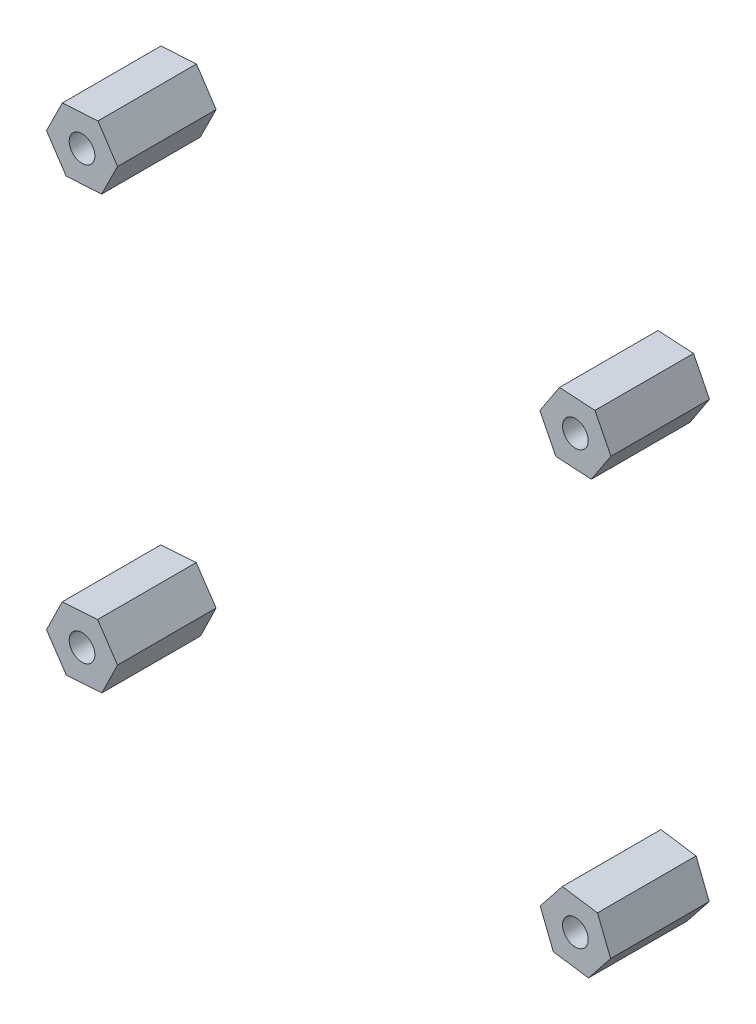
ISO-10303-21;
HEADER;
FILE_DESCRIPTION(('STEP AP214'),'2;1');
FILE_NAME('part.step','',(''),(''),'','','');
FILE_SCHEMA(('AUTOMOTIVE_DESIGN { 1 0 10303 214 1 1 1 1 }'));
ENDSEC;
DATA;
#1=APPLICATION_CONTEXT('core data for automotive mechanical design processes');
#2=APPLICATION_PROTOCOL_DEFINITION('international standard','automotive_design',2000,#1);
#3=PRODUCT_CONTEXT('',#1,'mechanical');
#4=PRODUCT('Part','Part','',(#3));
#5=PRODUCT_RELATED_PRODUCT_CATEGORY('part','',(#4));
#6=PRODUCT_DEFINITION_FORMATION('','',#4);
#7=PRODUCT_DEFINITION_CONTEXT('part definition',#1,'design');
#8=PRODUCT_DEFINITION('design','',#6,#7);
#9=PRODUCT_DEFINITION_SHAPE('','',#8);
#10=(LENGTH_UNIT() NAMED_UNIT(*) SI_UNIT(.MILLI.,.METRE.));
#11=(NAMED_UNIT(*) PLANE_ANGLE_UNIT() SI_UNIT($,.RADIAN.));
#12=(NAMED_UNIT(*) SI_UNIT($,.STERADIAN.) SOLID_ANGLE_UNIT());
#13=UNCERTAINTY_MEASURE_WITH_UNIT(LENGTH_MEASURE(1.E-05),#10,'distance_accuracy_value','');
#14=(GEOMETRIC_REPRESENTATION_CONTEXT(3) GLOBAL_UNCERTAINTY_ASSIGNED_CONTEXT((#13)) GLOBAL_UNIT_ASSIGNED_CONTEXT((#10,
#11,#12)) REPRESENTATION_CONTEXT('',''));
#15=CARTESIAN_POINT('',(0.,0.,0.));
#16=DIRECTION('',(0.,0.,1.));
#17=DIRECTION('',(1.,0.,0.));
#18=AXIS2_PLACEMENT_3D('',#15,#16,#17);
#19=CARTESIAN_POINT('',(0.,0.,9.6));
#20=DIRECTION('',(0.,0.,1.));
#21=DIRECTION('',(1.,0.,0.));
#22=AXIS2_PLACEMENT_3D('',#19,#20,#21);
#23=PLANE('',#22);
#24=DIRECTION('',(0.989172529402275,-0.14675730672067,0.));
#25=VECTOR('',#24,1.);
#26=CARTESIAN_POINT('',(-160.799093625759,61.6851735238354,9.6));
#27=LINE('',#26,#25);
#28=CARTESIAN_POINT('',(-160.799093625759,61.6851735238354,9.6));
#29=VERTEX_POINT('',#28);
#30=CARTESIAN_POINT('',(-157.372499469007,61.1767913005911,9.6));
#31=VERTEX_POINT('',#30);
#32=EDGE_CURVE('E141',#29,#31,#27,.T.);
#33=ORIENTED_EDGE('',*,*,#32,.T.);
#34=DIRECTION('',(0.621681820512219,0.783269885827748,0.));
#35=VECTOR('',#34,1.);
#36=CARTESIAN_POINT('',(-157.372499469007,61.1767913005911,9.6));
#37=LINE('',#36,#35);
#38=CARTESIAN_POINT('',(-155.218930470469,63.8901177771757,9.6));
#39=VERTEX_POINT('',#38);
#40=EDGE_CURVE('E99',#31,#39,#37,.T.);
#41=ORIENTED_EDGE('',*,*,#40,.T.);
#42=DIRECTION('',(-0.367490708890048,0.930027192548417,0.));
#43=VECTOR('',#42,1.);
#44=CARTESIAN_POINT('',(-155.218930470469,63.8901177771757,9.6));
#45=LINE('',#44,#43);
#46=CARTESIAN_POINT('',(-156.491955628683,67.1118264770047,9.6));
#47=VERTEX_POINT('',#46);
#48=EDGE_CURVE('E112',#39,#47,#45,.T.);
#49=ORIENTED_EDGE('',*,*,#48,.T.);
#50=DIRECTION('',(-0.989172529402274,0.146757306720679,0.));
#51=VECTOR('',#50,1.);
#52=CARTESIAN_POINT('',(-156.491955628683,67.1118264770047,9.6));
#53=LINE('',#52,#51);
#54=CARTESIAN_POINT('',(-159.918549785435,67.620208700249,9.6));
#55=VERTEX_POINT('',#54);
#56=EDGE_CURVE('E106',#47,#55,#53,.T.);
#57=ORIENTED_EDGE('',*,*,#56,.T.);
#58=DIRECTION('',(-0.621681820512227,-0.783269885827741,0.));
#59=VECTOR('',#58,1.);
#60=CARTESIAN_POINT('',(-159.918549785435,67.620208700249,9.6));
#61=LINE('',#60,#59);
#62=CARTESIAN_POINT('',(-162.072118783973,64.9068822236644,9.6));
#63=VERTEX_POINT('',#62);
#64=EDGE_CURVE('E110',#55,#63,#61,.T.);
#65=ORIENTED_EDGE('',*,*,#64,.T.);
#66=DIRECTION('',(0.367490708890047,-0.930027192548417,0.));
#67=VECTOR('',#66,1.);
#68=CARTESIAN_POINT('',(-162.072118783973,64.9068822236644,9.6));
#69=LINE('',#68,#67);
#70=EDGE_CURVE('E62',#63,#29,#69,.T.);
#71=ORIENTED_EDGE('',*,*,#70,.T.);
#72=EDGE_LOOP('',(#33,#41,#49,#57,#65,#71));
#73=FACE_BOUND('',#72,.T.);
#74=CARTESIAN_POINT('',(-158.645524627221,64.39850000042,9.6));
#75=DIRECTION('',(0.,0.,1.));
#76=DIRECTION('',(1.,0.,0.));
#77=AXIS2_PLACEMENT_3D('',#74,#75,#76);
#78=CIRCLE('',#77,1.25000000000001);
#79=CARTESIAN_POINT('',(-157.395524627221,64.39850000042,9.6));
#80=VERTEX_POINT('',#79);
#81=EDGE_CURVE('E134',#80,#80,#78,.T.);
#82=ORIENTED_EDGE('',*,*,#81,.F.);
#83=EDGE_LOOP('',(#82));
#84=FACE_BOUND('',#83,.T.);
#85=ADVANCED_FACE('F45',(#73,#84),#23,.T.);
#86=CARTESIAN_POINT('',(0.,0.,0.));
#87=DIRECTION('',(0.,0.,1.));
#88=DIRECTION('',(1.,0.,0.));
#89=AXIS2_PLACEMENT_3D('',#86,#87,#88);
#90=PLANE('',#89);
#91=DIRECTION('',(0.989172529402275,-0.14675730672067,0.));
#92=VECTOR('',#91,1.);
#93=CARTESIAN_POINT('',(-160.799093625759,61.6851735238354,0.));
#94=LINE('',#93,#92);
#95=CARTESIAN_POINT('',(-160.799093625759,61.6851735238354,0.));
#96=VERTEX_POINT('',#95);
#97=CARTESIAN_POINT('',(-157.372499469007,61.1767913005911,0.));
#98=VERTEX_POINT('',#97);
#99=EDGE_CURVE('E130',#96,#98,#94,.T.);
#100=ORIENTED_EDGE('',*,*,#99,.F.);
#101=DIRECTION('',(0.367490708890047,-0.930027192548417,0.));
#102=VECTOR('',#101,1.);
#103=CARTESIAN_POINT('',(-162.072118783973,64.9068822236644,0.));
#104=LINE('',#103,#102);
#105=CARTESIAN_POINT('',(-162.072118783973,64.9068822236644,0.));
#106=VERTEX_POINT('',#105);
#107=EDGE_CURVE('E91',#106,#96,#104,.T.);
#108=ORIENTED_EDGE('',*,*,#107,.F.);
#109=DIRECTION('',(-0.621681820512227,-0.783269885827741,0.));
#110=VECTOR('',#109,1.);
#111=CARTESIAN_POINT('',(-159.918549785435,67.620208700249,0.));
#112=LINE('',#111,#110);
#113=CARTESIAN_POINT('',(-159.918549785435,67.620208700249,0.));
#114=VERTEX_POINT('',#113);
#115=EDGE_CURVE('E85',#114,#106,#112,.T.);
#116=ORIENTED_EDGE('',*,*,#115,.F.);
#117=DIRECTION('',(-0.989172529402274,0.146757306720679,0.));
#118=VECTOR('',#117,1.);
#119=CARTESIAN_POINT('',(-156.491955628683,67.1118264770047,0.));
#120=LINE('',#119,#118);
#121=CARTESIAN_POINT('',(-156.491955628683,67.1118264770047,0.));
#122=VERTEX_POINT('',#121);
#123=EDGE_CURVE('E120',#122,#114,#120,.T.);
#124=ORIENTED_EDGE('',*,*,#123,.F.);
#125=DIRECTION('',(-0.367490708890048,0.930027192548417,0.));
#126=VECTOR('',#125,1.);
#127=CARTESIAN_POINT('',(-155.218930470469,63.8901177771757,0.));
#128=LINE('',#127,#126);
#129=CARTESIAN_POINT('',(-155.218930470469,63.8901177771757,0.));
#130=VERTEX_POINT('',#129);
#131=EDGE_CURVE('E136',#130,#122,#128,.T.);
#132=ORIENTED_EDGE('',*,*,#131,.F.);
#133=DIRECTION('',(0.621681820512219,0.783269885827748,0.));
#134=VECTOR('',#133,1.);
#135=CARTESIAN_POINT('',(-157.372499469007,61.1767913005911,0.));
#136=LINE('',#135,#134);
#137=EDGE_CURVE('E133',#98,#130,#136,.T.);
#138=ORIENTED_EDGE('',*,*,#137,.F.);
#139=EDGE_LOOP('',(#100,#108,#116,#124,#132,#138));
#140=FACE_BOUND('',#139,.T.);
#141=CARTESIAN_POINT('',(-158.645524627221,64.39850000042,0.));
#142=DIRECTION('',(0.,0.,1.));
#143=DIRECTION('',(1.,0.,0.));
#144=AXIS2_PLACEMENT_3D('',#141,#142,#143);
#145=CIRCLE('',#144,1.25000000000001);
#146=CARTESIAN_POINT('',(-157.395524627221,64.39850000042,0.));
#147=VERTEX_POINT('',#146);
#148=EDGE_CURVE('E234',#147,#147,#145,.T.);
#149=ORIENTED_EDGE('',*,*,#148,.T.);
#150=EDGE_LOOP('',(#149));
#151=FACE_BOUND('',#150,.T.);
#152=ADVANCED_FACE('F150',(#140,#151),#90,.F.);
#153=CARTESIAN_POINT('',(-160.799093625759,61.6851735238354,9.6));
#154=DIRECTION('',(0.14675730672067,0.989172529402275,0.));
#155=DIRECTION('',(-0.989172529402275,0.14675730672067,0.));
#156=AXIS2_PLACEMENT_3D('',#153,#154,#155);
#157=PLANE('',#156);
#158=ORIENTED_EDGE('',*,*,#99,.T.);
#159=DIRECTION('',(0.,0.,-1.));
#160=VECTOR('',#159,1.);
#161=CARTESIAN_POINT('',(-157.372499469007,61.1767913005911,9.6));
#162=LINE('',#161,#160);
#163=EDGE_CURVE('E12',#31,#98,#162,.T.);
#164=ORIENTED_EDGE('',*,*,#163,.F.);
#165=ORIENTED_EDGE('',*,*,#32,.F.);
#166=DIRECTION('',(0.,0.,-1.));
#167=VECTOR('',#166,1.);
#168=CARTESIAN_POINT('',(-160.799093625759,61.6851735238354,9.6));
#169=LINE('',#168,#167);
#170=EDGE_CURVE('E126',#29,#96,#169,.T.);
#171=ORIENTED_EDGE('',*,*,#170,.T.);
#172=EDGE_LOOP('',(#158,#164,#165,#171));
#173=FACE_BOUND('',#172,.T.);
#174=ADVANCED_FACE('F47',(#173),#157,.F.);
#175=CARTESIAN_POINT('',(-157.372499469007,61.1767913005911,9.6));
#176=DIRECTION('',(-0.783269885827748,0.621681820512219,0.));
#177=DIRECTION('',(-0.621681820512219,-0.783269885827748,0.));
#178=AXIS2_PLACEMENT_3D('',#175,#176,#177);
#179=PLANE('',#178);
#180=ORIENTED_EDGE('',*,*,#137,.T.);
#181=DIRECTION('',(0.,0.,-1.));
#182=VECTOR('',#181,1.);
#183=CARTESIAN_POINT('',(-155.218930470469,63.8901177771757,9.6));
#184=LINE('',#183,#182);
#185=EDGE_CURVE('E54',#39,#130,#184,.T.);
#186=ORIENTED_EDGE('',*,*,#185,.F.);
#187=ORIENTED_EDGE('',*,*,#40,.F.);
#188=ORIENTED_EDGE('',*,*,#163,.T.);
#189=EDGE_LOOP('',(#180,#186,#187,#188));
#190=FACE_BOUND('',#189,.T.);
#191=ADVANCED_FACE('F175',(#190),#179,.F.);
#192=CARTESIAN_POINT('',(-155.218930470469,63.8901177771757,9.6));
#193=DIRECTION('',(-0.930027192548417,-0.367490708890048,0.));
#194=DIRECTION('',(0.367490708890048,-0.930027192548417,0.));
#195=AXIS2_PLACEMENT_3D('',#192,#193,#194);
#196=PLANE('',#195);
#197=ORIENTED_EDGE('',*,*,#131,.T.);
#198=DIRECTION('',(0.,0.,-1.));
#199=VECTOR('',#198,1.);
#200=CARTESIAN_POINT('',(-156.491955628683,67.1118264770047,9.6));
#201=LINE('',#200,#199);
#202=EDGE_CURVE('E121',#47,#122,#201,.T.);
#203=ORIENTED_EDGE('',*,*,#202,.F.);
#204=ORIENTED_EDGE('',*,*,#48,.F.);
#205=ORIENTED_EDGE('',*,*,#185,.T.);
#206=EDGE_LOOP('',(#197,#203,#204,#205));
#207=FACE_BOUND('',#206,.T.);
#208=ADVANCED_FACE('F147',(#207),#196,.F.);
#209=CARTESIAN_POINT('',(-156.491955628683,67.1118264770047,9.6));
#210=DIRECTION('',(-0.146757306720679,-0.989172529402274,0.));
#211=DIRECTION('',(0.989172529402274,-0.146757306720679,0.));
#212=AXIS2_PLACEMENT_3D('',#209,#210,#211);
#213=PLANE('',#212);
#214=ORIENTED_EDGE('',*,*,#123,.T.);
#215=DIRECTION('',(0.,0.,-1.));
#216=VECTOR('',#215,1.);
#217=CARTESIAN_POINT('',(-159.918549785435,67.620208700249,9.6));
#218=LINE('',#217,#216);
#219=EDGE_CURVE('E117',#55,#114,#218,.T.);
#220=ORIENTED_EDGE('',*,*,#219,.F.);
#221=ORIENTED_EDGE('',*,*,#56,.F.);
#222=ORIENTED_EDGE('',*,*,#202,.T.);
#223=EDGE_LOOP('',(#214,#220,#221,#222));
#224=FACE_BOUND('',#223,.T.);
#225=ADVANCED_FACE('F118',(#224),#213,.F.);
#226=CARTESIAN_POINT('',(-159.918549785435,67.620208700249,9.6));
#227=DIRECTION('',(0.783269885827741,-0.621681820512227,0.));
#228=DIRECTION('',(0.621681820512227,0.783269885827741,0.));
#229=AXIS2_PLACEMENT_3D('',#226,#227,#228);
#230=PLANE('',#229);
#231=ORIENTED_EDGE('',*,*,#115,.T.);
#232=DIRECTION('',(0.,0.,-1.));
#233=VECTOR('',#232,1.);
#234=CARTESIAN_POINT('',(-162.072118783973,64.9068822236644,9.6));
#235=LINE('',#234,#233);
#236=EDGE_CURVE('E122',#63,#106,#235,.T.);
#237=ORIENTED_EDGE('',*,*,#236,.F.);
#238=ORIENTED_EDGE('',*,*,#64,.F.);
#239=ORIENTED_EDGE('',*,*,#219,.T.);
#240=EDGE_LOOP('',(#231,#237,#238,#239));
#241=FACE_BOUND('',#240,.T.);
#242=ADVANCED_FACE('F124',(#241),#230,.F.);
#243=CARTESIAN_POINT('',(-162.072118783973,64.9068822236644,9.6));
#244=DIRECTION('',(0.930027192548417,0.367490708890047,0.));
#245=DIRECTION('',(-0.367490708890047,0.930027192548417,0.));
#246=AXIS2_PLACEMENT_3D('',#243,#244,#245);
#247=PLANE('',#246);
#248=ORIENTED_EDGE('',*,*,#107,.T.);
#249=ORIENTED_EDGE('',*,*,#170,.F.);
#250=ORIENTED_EDGE('',*,*,#70,.F.);
#251=ORIENTED_EDGE('',*,*,#236,.T.);
#252=EDGE_LOOP('',(#248,#249,#250,#251));
#253=FACE_BOUND('',#252,.T.);
#254=ADVANCED_FACE('F155',(#253),#247,.F.);
#255=CARTESIAN_POINT('',(-158.645524627221,64.39850000042,9.6));
#256=DIRECTION('',(0.,0.,-1.));
#257=DIRECTION('',(-1.,0.,0.));
#258=AXIS2_PLACEMENT_3D('',#255,#256,#257);
#259=CYLINDRICAL_SURFACE('',#258,1.25000000000001);
#260=ORIENTED_EDGE('',*,*,#81,.T.);
#261=EDGE_LOOP('',(#260));
#262=FACE_BOUND('',#261,.T.);
#263=ORIENTED_EDGE('',*,*,#148,.F.);
#264=EDGE_LOOP('',(#263));
#265=FACE_BOUND('',#264,.T.);
#266=ADVANCED_FACE('F157',(#262,#265),#259,.F.);
#267=CLOSED_SHELL('',(#85,#152,#174,#191,#208,#225,#242,#254,#266));
#268=MANIFOLD_SOLID_BREP('B2',#267);
#269=CARTESIAN_POINT('',(0.,0.,9.6));
#270=DIRECTION('',(0.,0.,1.));
#271=DIRECTION('',(1.,0.,0.));
#272=AXIS2_PLACEMENT_3D('',#269,#270,#271);
#273=PLANE('',#272);
#274=DIRECTION('',(0.99756272015797,0.069775492481471,0.));
#275=VECTOR('',#274,1.);
#276=CARTESIAN_POINT('',(-208.204027464827,61.2849571418451,9.6));
#277=LINE('',#276,#275);
#278=CARTESIAN_POINT('',(-208.204027464827,61.2849571418451,9.6));
#279=VERTEX_POINT('',#278);
#280=CARTESIAN_POINT('',(-204.748368834726,61.5266665380472,9.6));
#281=VERTEX_POINT('',#280);
#282=EDGE_CURVE('E347',#279,#281,#277,.T.);
#283=ORIENTED_EDGE('',*,*,#282,.T.);
#284=DIRECTION('',(0.438354011028461,0.898802403765844,0.));
#285=VECTOR('',#284,1.);
#286=CARTESIAN_POINT('',(-204.748368834726,61.5266665380472,9.6));
#287=LINE('',#286,#285);
#288=CARTESIAN_POINT('',(-203.229865997121,64.6402093966221,9.6));
#289=VERTEX_POINT('',#288);
#290=EDGE_CURVE('E305',#281,#289,#287,.T.);
#291=ORIENTED_EDGE('',*,*,#290,.T.);
#292=DIRECTION('',(-0.559208709129512,0.829026911284371,0.));
#293=VECTOR('',#292,1.);
#294=CARTESIAN_POINT('',(-203.229865997121,64.6402093966221,9.6));
#295=LINE('',#294,#293);
#296=CARTESIAN_POINT('',(-205.167021789615,67.512042858995,9.6));
#297=VERTEX_POINT('',#296);
#298=EDGE_CURVE('E318',#289,#297,#295,.T.);
#299=ORIENTED_EDGE('',*,*,#298,.T.);
#300=DIRECTION('',(-0.997562720157972,-0.0697754924814422,0.));
#301=VECTOR('',#300,1.);
#302=CARTESIAN_POINT('',(-205.167021789615,67.512042858995,9.6));
#303=LINE('',#302,#301);
#304=CARTESIAN_POINT('',(-208.622680419716,67.270333462793,9.6));
#305=VERTEX_POINT('',#304);
#306=EDGE_CURVE('E312',#297,#305,#303,.T.);
#307=ORIENTED_EDGE('',*,*,#306,.T.);
#308=DIRECTION('',(-0.438354011028488,-0.898802403765831,0.));
#309=VECTOR('',#308,1.);
#310=CARTESIAN_POINT('',(-208.622680419716,67.270333462793,9.6));
#311=LINE('',#310,#309);
#312=CARTESIAN_POINT('',(-210.141183257321,64.156790604218,9.6));
#313=VERTEX_POINT('',#312);
#314=EDGE_CURVE('E316',#305,#313,#311,.T.);
#315=ORIENTED_EDGE('',*,*,#314,.T.);
#316=DIRECTION('',(0.559208709129508,-0.829026911284374,0.));
#317=VECTOR('',#316,1.);
#318=CARTESIAN_POINT('',(-210.141183257321,64.156790604218,9.6));
#319=LINE('',#318,#317);
#320=EDGE_CURVE('E268',#313,#279,#319,.T.);
#321=ORIENTED_EDGE('',*,*,#320,.T.);
#322=EDGE_LOOP('',(#283,#291,#299,#307,#315,#321));
#323=FACE_BOUND('',#322,.T.);
#324=CARTESIAN_POINT('',(-206.685524627221,64.3985000004201,9.6));
#325=DIRECTION('',(0.,0.,1.));
#326=DIRECTION('',(1.,0.,0.));
#327=AXIS2_PLACEMENT_3D('',#324,#325,#326);
#328=CIRCLE('',#327,1.25000000000001);
#329=CARTESIAN_POINT('',(-205.435524627221,64.3985000004201,9.6));
#330=VERTEX_POINT('',#329);
#331=EDGE_CURVE('E340',#330,#330,#328,.T.);
#332=ORIENTED_EDGE('',*,*,#331,.F.);
#333=EDGE_LOOP('',(#332));
#334=FACE_BOUND('',#333,.T.);
#335=ADVANCED_FACE('F251',(#323,#334),#273,.T.);
#336=CARTESIAN_POINT('',(0.,0.,0.));
#337=DIRECTION('',(0.,0.,1.));
#338=DIRECTION('',(1.,0.,0.));
#339=AXIS2_PLACEMENT_3D('',#336,#337,#338);
#340=PLANE('',#339);
#341=DIRECTION('',(0.99756272015797,0.069775492481471,0.));
#342=VECTOR('',#341,1.);
#343=CARTESIAN_POINT('',(-208.204027464827,61.2849571418451,0.));
#344=LINE('',#343,#342);
#345=CARTESIAN_POINT('',(-208.204027464827,61.2849571418451,0.));
#346=VERTEX_POINT('',#345);
#347=CARTESIAN_POINT('',(-204.748368834726,61.5266665380472,0.));
#348=VERTEX_POINT('',#347);
#349=EDGE_CURVE('E336',#346,#348,#344,.T.);
#350=ORIENTED_EDGE('',*,*,#349,.F.);
#351=DIRECTION('',(0.559208709129508,-0.829026911284374,0.));
#352=VECTOR('',#351,1.);
#353=CARTESIAN_POINT('',(-210.141183257321,64.156790604218,0.));
#354=LINE('',#353,#352);
#355=CARTESIAN_POINT('',(-210.141183257321,64.156790604218,0.));
#356=VERTEX_POINT('',#355);
#357=EDGE_CURVE('E297',#356,#346,#354,.T.);
#358=ORIENTED_EDGE('',*,*,#357,.F.);
#359=DIRECTION('',(-0.438354011028488,-0.898802403765831,0.));
#360=VECTOR('',#359,1.);
#361=CARTESIAN_POINT('',(-208.622680419716,67.270333462793,0.));
#362=LINE('',#361,#360);
#363=CARTESIAN_POINT('',(-208.622680419716,67.270333462793,0.));
#364=VERTEX_POINT('',#363);
#365=EDGE_CURVE('E291',#364,#356,#362,.T.);
#366=ORIENTED_EDGE('',*,*,#365,.F.);
#367=DIRECTION('',(-0.997562720157972,-0.0697754924814422,0.));
#368=VECTOR('',#367,1.);
#369=CARTESIAN_POINT('',(-205.167021789615,67.512042858995,0.));
#370=LINE('',#369,#368);
#371=CARTESIAN_POINT('',(-205.167021789615,67.512042858995,0.));
#372=VERTEX_POINT('',#371);
#373=EDGE_CURVE('E326',#372,#364,#370,.T.);
#374=ORIENTED_EDGE('',*,*,#373,.F.);
#375=DIRECTION('',(-0.559208709129512,0.829026911284371,0.));
#376=VECTOR('',#375,1.);
#377=CARTESIAN_POINT('',(-203.229865997121,64.6402093966221,0.));
#378=LINE('',#377,#376);
#379=CARTESIAN_POINT('',(-203.229865997121,64.6402093966221,0.));
#380=VERTEX_POINT('',#379);
#381=EDGE_CURVE('E342',#380,#372,#378,.T.);
#382=ORIENTED_EDGE('',*,*,#381,.F.);
#383=DIRECTION('',(0.438354011028461,0.898802403765844,0.));
#384=VECTOR('',#383,1.);
#385=CARTESIAN_POINT('',(-204.748368834726,61.5266665380472,0.));
#386=LINE('',#385,#384);
#387=EDGE_CURVE('E339',#348,#380,#386,.T.);
#388=ORIENTED_EDGE('',*,*,#387,.F.);
#389=EDGE_LOOP('',(#350,#358,#366,#374,#382,#388));
#390=FACE_BOUND('',#389,.T.);
#391=CARTESIAN_POINT('',(-206.685524627221,64.3985000004201,0.));
#392=DIRECTION('',(0.,0.,1.));
#393=DIRECTION('',(1.,0.,0.));
#394=AXIS2_PLACEMENT_3D('',#391,#392,#393);
#395=CIRCLE('',#394,1.25000000000001);
#396=CARTESIAN_POINT('',(-205.435524627221,64.3985000004201,0.));
#397=VERTEX_POINT('',#396);
#398=EDGE_CURVE('E440',#397,#397,#395,.T.);
#399=ORIENTED_EDGE('',*,*,#398,.T.);
#400=EDGE_LOOP('',(#399));
#401=FACE_BOUND('',#400,.T.);
#402=ADVANCED_FACE('F356',(#390,#401),#340,.F.);
#403=CARTESIAN_POINT('',(-208.204027464827,61.2849571418451,9.6));
#404=DIRECTION('',(-0.069775492481471,0.99756272015797,0.));
#405=DIRECTION('',(-0.99756272015797,-0.069775492481471,0.));
#406=AXIS2_PLACEMENT_3D('',#403,#404,#405);
#407=PLANE('',#406);
#408=ORIENTED_EDGE('',*,*,#349,.T.);
#409=DIRECTION('',(0.,0.,-1.));
#410=VECTOR('',#409,1.);
#411=CARTESIAN_POINT('',(-204.748368834726,61.5266665380472,9.6));
#412=LINE('',#411,#410);
#413=EDGE_CURVE('E43',#281,#348,#412,.T.);
#414=ORIENTED_EDGE('',*,*,#413,.F.);
#415=ORIENTED_EDGE('',*,*,#282,.F.);
#416=DIRECTION('',(0.,0.,-1.));
#417=VECTOR('',#416,1.);
#418=CARTESIAN_POINT('',(-208.204027464827,61.2849571418451,9.6));
#419=LINE('',#418,#417);
#420=EDGE_CURVE('E332',#279,#346,#419,.T.);
#421=ORIENTED_EDGE('',*,*,#420,.T.);
#422=EDGE_LOOP('',(#408,#414,#415,#421));
#423=FACE_BOUND('',#422,.T.);
#424=ADVANCED_FACE('F253',(#423),#407,.F.);
#425=CARTESIAN_POINT('',(-204.748368834726,61.5266665380472,9.6));
#426=DIRECTION('',(-0.898802403765844,0.438354011028461,0.));
#427=DIRECTION('',(-0.438354011028461,-0.898802403765844,0.));
#428=AXIS2_PLACEMENT_3D('',#425,#426,#427);
#429=PLANE('',#428);
#430=ORIENTED_EDGE('',*,*,#387,.T.);
#431=DIRECTION('',(0.,0.,-1.));
#432=VECTOR('',#431,1.);
#433=CARTESIAN_POINT('',(-203.229865997121,64.6402093966221,9.6));
#434=LINE('',#433,#432);
#435=EDGE_CURVE('E260',#289,#380,#434,.T.);
#436=ORIENTED_EDGE('',*,*,#435,.F.);
#437=ORIENTED_EDGE('',*,*,#290,.F.);
#438=ORIENTED_EDGE('',*,*,#413,.T.);
#439=EDGE_LOOP('',(#430,#436,#437,#438));
#440=FACE_BOUND('',#439,.T.);
#441=ADVANCED_FACE('F381',(#440),#429,.F.);
#442=CARTESIAN_POINT('',(-203.229865997121,64.6402093966221,9.6));
#443=DIRECTION('',(-0.829026911284371,-0.559208709129512,0.));
#444=DIRECTION('',(0.559208709129512,-0.829026911284371,0.));
#445=AXIS2_PLACEMENT_3D('',#442,#443,#444);
#446=PLANE('',#445);
#447=ORIENTED_EDGE('',*,*,#381,.T.);
#448=DIRECTION('',(0.,0.,-1.));
#449=VECTOR('',#448,1.);
#450=CARTESIAN_POINT('',(-205.167021789615,67.512042858995,9.6));
#451=LINE('',#450,#449);
#452=EDGE_CURVE('E327',#297,#372,#451,.T.);
#453=ORIENTED_EDGE('',*,*,#452,.F.);
#454=ORIENTED_EDGE('',*,*,#298,.F.);
#455=ORIENTED_EDGE('',*,*,#435,.T.);
#456=EDGE_LOOP('',(#447,#453,#454,#455));
#457=FACE_BOUND('',#456,.T.);
#458=ADVANCED_FACE('F353',(#457),#446,.F.);
#459=CARTESIAN_POINT('',(-205.167021789615,67.512042858995,9.6));
#460=DIRECTION('',(0.0697754924814422,-0.997562720157972,0.));
#461=DIRECTION('',(0.997562720157972,0.0697754924814422,0.));
#462=AXIS2_PLACEMENT_3D('',#459,#460,#461);
#463=PLANE('',#462);
#464=ORIENTED_EDGE('',*,*,#373,.T.);
#465=DIRECTION('',(0.,0.,-1.));
#466=VECTOR('',#465,1.);
#467=CARTESIAN_POINT('',(-208.622680419716,67.270333462793,9.6));
#468=LINE('',#467,#466);
#469=EDGE_CURVE('E323',#305,#364,#468,.T.);
#470=ORIENTED_EDGE('',*,*,#469,.F.);
#471=ORIENTED_EDGE('',*,*,#306,.F.);
#472=ORIENTED_EDGE('',*,*,#452,.T.);
#473=EDGE_LOOP('',(#464,#470,#471,#472));
#474=FACE_BOUND('',#473,.T.);
#475=ADVANCED_FACE('F324',(#474),#463,.F.);
#476=CARTESIAN_POINT('',(-208.622680419716,67.270333462793,9.6));
#477=DIRECTION('',(0.898802403765831,-0.438354011028488,0.));
#478=DIRECTION('',(0.438354011028488,0.898802403765831,0.));
#479=AXIS2_PLACEMENT_3D('',#476,#477,#478);
#480=PLANE('',#479);
#481=ORIENTED_EDGE('',*,*,#365,.T.);
#482=DIRECTION('',(0.,0.,-1.));
#483=VECTOR('',#482,1.);
#484=CARTESIAN_POINT('',(-210.141183257321,64.156790604218,9.6));
#485=LINE('',#484,#483);
#486=EDGE_CURVE('E328',#313,#356,#485,.T.);
#487=ORIENTED_EDGE('',*,*,#486,.F.);
#488=ORIENTED_EDGE('',*,*,#314,.F.);
#489=ORIENTED_EDGE('',*,*,#469,.T.);
#490=EDGE_LOOP('',(#481,#487,#488,#489));
#491=FACE_BOUND('',#490,.T.);
#492=ADVANCED_FACE('F330',(#491),#480,.F.);
#493=CARTESIAN_POINT('',(-210.141183257321,64.156790604218,9.6));
#494=DIRECTION('',(0.829026911284374,0.559208709129508,0.));
#495=DIRECTION('',(-0.559208709129508,0.829026911284374,0.));
#496=AXIS2_PLACEMENT_3D('',#493,#494,#495);
#497=PLANE('',#496);
#498=ORIENTED_EDGE('',*,*,#357,.T.);
#499=ORIENTED_EDGE('',*,*,#420,.F.);
#500=ORIENTED_EDGE('',*,*,#320,.F.);
#501=ORIENTED_EDGE('',*,*,#486,.T.);
#502=EDGE_LOOP('',(#498,#499,#500,#501));
#503=FACE_BOUND('',#502,.T.);
#504=ADVANCED_FACE('F361',(#503),#497,.F.);
#505=CARTESIAN_POINT('',(-206.685524627221,64.3985000004201,9.6));
#506=DIRECTION('',(0.,0.,-1.));
#507=DIRECTION('',(-1.,0.,0.));
#508=AXIS2_PLACEMENT_3D('',#505,#506,#507);
#509=CYLINDRICAL_SURFACE('',#508,1.25000000000001);
#510=ORIENTED_EDGE('',*,*,#331,.T.);
#511=EDGE_LOOP('',(#510));
#512=FACE_BOUND('',#511,.T.);
#513=ORIENTED_EDGE('',*,*,#398,.F.);
#514=EDGE_LOOP('',(#513));
#515=FACE_BOUND('',#514,.T.);
#516=ADVANCED_FACE('F363',(#512,#515),#509,.F.);
#517=CLOSED_SHELL('',(#335,#402,#424,#441,#458,#475,#492,#504,#516));
#518=MANIFOLD_SOLID_BREP('B6',#517);
#519=CARTESIAN_POINT('',(0.,0.,9.6));
#520=DIRECTION('',(0.,0.,1.));
#521=DIRECTION('',(1.,0.,0.));
#522=AXIS2_PLACEMENT_3D('',#519,#520,#521);
#523=PLANE('',#522);
#524=DIRECTION('',(0.998260005291912,-0.0589657683286763,0.));
#525=VECTOR('',#524,1.);
#526=CARTESIAN_POINT('',(-160.551458980537,103.575851691197,9.6));
#527=LINE('',#526,#525);
#528=CARTESIAN_POINT('',(-160.551458980537,103.575851691197,9.6));
#529=VERTEX_POINT('',#528);
#530=CARTESIAN_POINT('',(-157.093384883877,103.371588277892,9.6));
#531=VERTEX_POINT('',#530);
#532=EDGE_CURVE('E552',#529,#531,#527,.T.);
#533=ORIENTED_EDGE('',*,*,#532,.T.);
#534=DIRECTION('',(0.55019585597226,0.835035640000445,0.));
#535=VECTOR('',#534,1.);
#536=CARTESIAN_POINT('',(-157.093384883877,103.371588277892,9.6));
#537=LINE('',#536,#535);
#538=CARTESIAN_POINT('',(-155.187450530562,106.264236587115,9.6));
#539=VERTEX_POINT('',#538);
#540=EDGE_CURVE('E510',#531,#539,#537,.T.);
#541=ORIENTED_EDGE('',*,*,#540,.T.);
#542=DIRECTION('',(-0.448064149319646,0.894001408329127,0.));
#543=VECTOR('',#542,1.);
#544=CARTESIAN_POINT('',(-155.187450530562,106.264236587115,9.6));
#545=LINE('',#544,#543);
#546=CARTESIAN_POINT('',(-156.739590273905,109.361148309643,9.6));
#547=VERTEX_POINT('',#546);
#548=EDGE_CURVE('E523',#539,#547,#545,.T.);
#549=ORIENTED_EDGE('',*,*,#548,.T.);
#550=DIRECTION('',(-0.998260005291911,0.0589657683286962,0.));
#551=VECTOR('',#550,1.);
#552=CARTESIAN_POINT('',(-156.739590273905,109.361148309643,9.6));
#553=LINE('',#552,#551);
#554=CARTESIAN_POINT('',(-160.197664370564,109.565411722948,9.6));
#555=VERTEX_POINT('',#554);
#556=EDGE_CURVE('E517',#547,#555,#553,.T.);
#557=ORIENTED_EDGE('',*,*,#556,.T.);
#558=DIRECTION('',(-0.550195855972275,-0.835035640000435,0.));
#559=VECTOR('',#558,1.);
#560=CARTESIAN_POINT('',(-160.197664370564,109.565411722948,9.6));
#561=LINE('',#560,#559);
#562=CARTESIAN_POINT('',(-162.10359872388,106.672763413725,9.6));
#563=VERTEX_POINT('',#562);
#564=EDGE_CURVE('E521',#555,#563,#561,.T.);
#565=ORIENTED_EDGE('',*,*,#564,.T.);
#566=DIRECTION('',(0.448064149319647,-0.894001408329126,0.));
#567=VECTOR('',#566,1.);
#568=CARTESIAN_POINT('',(-162.10359872388,106.672763413725,9.6));
#569=LINE('',#568,#567);
#570=EDGE_CURVE('E473',#563,#529,#569,.T.);
#571=ORIENTED_EDGE('',*,*,#570,.T.);
#572=EDGE_LOOP('',(#533,#541,#549,#557,#565,#571));
#573=FACE_BOUND('',#572,.T.);
#574=CARTESIAN_POINT('',(-158.645524627221,106.46850000042,9.6));
#575=DIRECTION('',(0.,0.,1.));
#576=DIRECTION('',(1.,0.,0.));
#577=AXIS2_PLACEMENT_3D('',#574,#575,#576);
#578=CIRCLE('',#577,1.25000000000001);
#579=CARTESIAN_POINT('',(-157.395524627221,106.46850000042,9.6));
#580=VERTEX_POINT('',#579);
#581=EDGE_CURVE('E545',#580,#580,#578,.T.);
#582=ORIENTED_EDGE('',*,*,#581,.F.);
#583=EDGE_LOOP('',(#582));
#584=FACE_BOUND('',#583,.T.);
#585=ADVANCED_FACE('F456',(#573,#584),#523,.T.);
#586=CARTESIAN_POINT('',(0.,0.,0.));
#587=DIRECTION('',(0.,0.,1.));
#588=DIRECTION('',(1.,0.,0.));
#589=AXIS2_PLACEMENT_3D('',#586,#587,#588);
#590=PLANE('',#589);
#591=DIRECTION('',(0.998260005291912,-0.0589657683286763,0.));
#592=VECTOR('',#591,1.);
#593=CARTESIAN_POINT('',(-160.551458980537,103.575851691197,0.));
#594=LINE('',#593,#592);
#595=CARTESIAN_POINT('',(-160.551458980537,103.575851691197,0.));
#596=VERTEX_POINT('',#595);
#597=CARTESIAN_POINT('',(-157.093384883877,103.371588277892,0.));
#598=VERTEX_POINT('',#597);
#599=EDGE_CURVE('E541',#596,#598,#594,.T.);
#600=ORIENTED_EDGE('',*,*,#599,.F.);
#601=DIRECTION('',(0.448064149319647,-0.894001408329126,0.));
#602=VECTOR('',#601,1.);
#603=CARTESIAN_POINT('',(-162.10359872388,106.672763413725,0.));
#604=LINE('',#603,#602);
#605=CARTESIAN_POINT('',(-162.10359872388,106.672763413725,0.));
#606=VERTEX_POINT('',#605);
#607=EDGE_CURVE('E502',#606,#596,#604,.T.);
#608=ORIENTED_EDGE('',*,*,#607,.F.);
#609=DIRECTION('',(-0.550195855972275,-0.835035640000435,0.));
#610=VECTOR('',#609,1.);
#611=CARTESIAN_POINT('',(-160.197664370564,109.565411722948,0.));
#612=LINE('',#611,#610);
#613=CARTESIAN_POINT('',(-160.197664370564,109.565411722948,0.));
#614=VERTEX_POINT('',#613);
#615=EDGE_CURVE('E496',#614,#606,#612,.T.);
#616=ORIENTED_EDGE('',*,*,#615,.F.);
#617=DIRECTION('',(-0.998260005291911,0.0589657683286962,0.));
#618=VECTOR('',#617,1.);
#619=CARTESIAN_POINT('',(-156.739590273905,109.361148309643,0.));
#620=LINE('',#619,#618);
#621=CARTESIAN_POINT('',(-156.739590273905,109.361148309643,0.));
#622=VERTEX_POINT('',#621);
#623=EDGE_CURVE('E531',#622,#614,#620,.T.);
#624=ORIENTED_EDGE('',*,*,#623,.F.);
#625=DIRECTION('',(-0.448064149319646,0.894001408329127,0.));
#626=VECTOR('',#625,1.);
#627=CARTESIAN_POINT('',(-155.187450530562,106.264236587115,0.));
#628=LINE('',#627,#626);
#629=CARTESIAN_POINT('',(-155.187450530562,106.264236587115,0.));
#630=VERTEX_POINT('',#629);
#631=EDGE_CURVE('E547',#630,#622,#628,.T.);
#632=ORIENTED_EDGE('',*,*,#631,.F.);
#633=DIRECTION('',(0.55019585597226,0.835035640000445,0.));
#634=VECTOR('',#633,1.);
#635=CARTESIAN_POINT('',(-157.093384883877,103.371588277892,0.));
#636=LINE('',#635,#634);
#637=EDGE_CURVE('E544',#598,#630,#636,.T.);
#638=ORIENTED_EDGE('',*,*,#637,.F.);
#639=EDGE_LOOP('',(#600,#608,#616,#624,#632,#638));
#640=FACE_BOUND('',#639,.T.);
#641=CARTESIAN_POINT('',(-158.645524627221,106.46850000042,0.));
#642=DIRECTION('',(0.,0.,1.));
#643=DIRECTION('',(1.,0.,0.));
#644=AXIS2_PLACEMENT_3D('',#641,#642,#643);
#645=CIRCLE('',#644,1.25000000000001);
#646=CARTESIAN_POINT('',(-157.395524627221,106.46850000042,0.));
#647=VERTEX_POINT('',#646);
#648=EDGE_CURVE('E645',#647,#647,#645,.T.);
#649=ORIENTED_EDGE('',*,*,#648,.T.);
#650=EDGE_LOOP('',(#649));
#651=FACE_BOUND('',#650,.T.);
#652=ADVANCED_FACE('F561',(#640,#651),#590,.F.);
#653=CARTESIAN_POINT('',(-160.551458980537,103.575851691197,9.6));
#654=DIRECTION('',(0.0589657683286763,0.998260005291912,0.));
#655=DIRECTION('',(-0.998260005291912,0.0589657683286763,0.));
#656=AXIS2_PLACEMENT_3D('',#653,#654,#655);
#657=PLANE('',#656);
#658=ORIENTED_EDGE('',*,*,#599,.T.);
#659=DIRECTION('',(0.,0.,-1.));
#660=VECTOR('',#659,1.);
#661=CARTESIAN_POINT('',(-157.093384883877,103.371588277892,9.6));
#662=LINE('',#661,#660);
#663=EDGE_CURVE('E249',#531,#598,#662,.T.);
#664=ORIENTED_EDGE('',*,*,#663,.F.);
#665=ORIENTED_EDGE('',*,*,#532,.F.);
#666=DIRECTION('',(0.,0.,-1.));
#667=VECTOR('',#666,1.);
#668=CARTESIAN_POINT('',(-160.551458980537,103.575851691197,9.6));
#669=LINE('',#668,#667);
#670=EDGE_CURVE('E537',#529,#596,#669,.T.);
#671=ORIENTED_EDGE('',*,*,#670,.T.);
#672=EDGE_LOOP('',(#658,#664,#665,#671));
#673=FACE_BOUND('',#672,.T.);
#674=ADVANCED_FACE('F458',(#673),#657,.F.);
#675=CARTESIAN_POINT('',(-157.093384883877,103.371588277892,9.6));
#676=DIRECTION('',(-0.835035640000445,0.55019585597226,0.));
#677=DIRECTION('',(-0.55019585597226,-0.835035640000445,0.));
#678=AXIS2_PLACEMENT_3D('',#675,#676,#677);
#679=PLANE('',#678);
#680=ORIENTED_EDGE('',*,*,#637,.T.);
#681=DIRECTION('',(0.,0.,-1.));
#682=VECTOR('',#681,1.);
#683=CARTESIAN_POINT('',(-155.187450530562,106.264236587115,9.6));
#684=LINE('',#683,#682);
#685=EDGE_CURVE('E465',#539,#630,#684,.T.);
#686=ORIENTED_EDGE('',*,*,#685,.F.);
#687=ORIENTED_EDGE('',*,*,#540,.F.);
#688=ORIENTED_EDGE('',*,*,#663,.T.);
#689=EDGE_LOOP('',(#680,#686,#687,#688));
#690=FACE_BOUND('',#689,.T.);
#691=ADVANCED_FACE('F586',(#690),#679,.F.);
#692=CARTESIAN_POINT('',(-155.187450530562,106.264236587115,9.6));
#693=DIRECTION('',(-0.894001408329127,-0.448064149319646,0.));
#694=DIRECTION('',(0.448064149319646,-0.894001408329127,0.));
#695=AXIS2_PLACEMENT_3D('',#692,#693,#694);
#696=PLANE('',#695);
#697=ORIENTED_EDGE('',*,*,#631,.T.);
#698=DIRECTION('',(0.,0.,-1.));
#699=VECTOR('',#698,1.);
#700=CARTESIAN_POINT('',(-156.739590273905,109.361148309643,9.6));
#701=LINE('',#700,#699);
#702=EDGE_CURVE('E532',#547,#622,#701,.T.);
#703=ORIENTED_EDGE('',*,*,#702,.F.);
#704=ORIENTED_EDGE('',*,*,#548,.F.);
#705=ORIENTED_EDGE('',*,*,#685,.T.);
#706=EDGE_LOOP('',(#697,#703,#704,#705));
#707=FACE_BOUND('',#706,.T.);
#708=ADVANCED_FACE('F558',(#707),#696,.F.);
#709=CARTESIAN_POINT('',(-156.739590273905,109.361148309643,9.6));
#710=DIRECTION('',(-0.0589657683286962,-0.998260005291911,0.));
#711=DIRECTION('',(0.998260005291911,-0.0589657683286962,0.));
#712=AXIS2_PLACEMENT_3D('',#709,#710,#711);
#713=PLANE('',#712);
#714=ORIENTED_EDGE('',*,*,#623,.T.);
#715=DIRECTION('',(0.,0.,-1.));
#716=VECTOR('',#715,1.);
#717=CARTESIAN_POINT('',(-160.197664370564,109.565411722948,9.6));
#718=LINE('',#717,#716);
#719=EDGE_CURVE('E528',#555,#614,#718,.T.);
#720=ORIENTED_EDGE('',*,*,#719,.F.);
#721=ORIENTED_EDGE('',*,*,#556,.F.);
#722=ORIENTED_EDGE('',*,*,#702,.T.);
#723=EDGE_LOOP('',(#714,#720,#721,#722));
#724=FACE_BOUND('',#723,.T.);
#725=ADVANCED_FACE('F529',(#724),#713,.F.);
#726=CARTESIAN_POINT('',(-160.197664370564,109.565411722948,9.6));
#727=DIRECTION('',(0.835035640000435,-0.550195855972275,0.));
#728=DIRECTION('',(0.550195855972275,0.835035640000435,0.));
#729=AXIS2_PLACEMENT_3D('',#726,#727,#728);
#730=PLANE('',#729);
#731=ORIENTED_EDGE('',*,*,#615,.T.);
#732=DIRECTION('',(0.,0.,-1.));
#733=VECTOR('',#732,1.);
#734=CARTESIAN_POINT('',(-162.10359872388,106.672763413725,9.6));
#735=LINE('',#734,#733);
#736=EDGE_CURVE('E533',#563,#606,#735,.T.);
#737=ORIENTED_EDGE('',*,*,#736,.F.);
#738=ORIENTED_EDGE('',*,*,#564,.F.);
#739=ORIENTED_EDGE('',*,*,#719,.T.);
#740=EDGE_LOOP('',(#731,#737,#738,#739));
#741=FACE_BOUND('',#740,.T.);
#742=ADVANCED_FACE('F535',(#741),#730,.F.);
#743=CARTESIAN_POINT('',(-162.10359872388,106.672763413725,9.6));
#744=DIRECTION('',(0.894001408329126,0.448064149319647,0.));
#745=DIRECTION('',(-0.448064149319647,0.894001408329126,0.));
#746=AXIS2_PLACEMENT_3D('',#743,#744,#745);
#747=PLANE('',#746);
#748=ORIENTED_EDGE('',*,*,#607,.T.);
#749=ORIENTED_EDGE('',*,*,#670,.F.);
#750=ORIENTED_EDGE('',*,*,#570,.F.);
#751=ORIENTED_EDGE('',*,*,#736,.T.);
#752=EDGE_LOOP('',(#748,#749,#750,#751));
#753=FACE_BOUND('',#752,.T.);
#754=ADVANCED_FACE('F566',(#753),#747,.F.);
#755=CARTESIAN_POINT('',(-158.645524627221,106.46850000042,9.6));
#756=DIRECTION('',(0.,0.,-1.));
#757=DIRECTION('',(-1.,0.,0.));
#758=AXIS2_PLACEMENT_3D('',#755,#756,#757);
#759=CYLINDRICAL_SURFACE('',#758,1.25000000000001);
#760=ORIENTED_EDGE('',*,*,#581,.T.);
#761=EDGE_LOOP('',(#760));
#762=FACE_BOUND('',#761,.T.);
#763=ORIENTED_EDGE('',*,*,#648,.F.);
#764=EDGE_LOOP('',(#763));
#765=FACE_BOUND('',#764,.T.);
#766=ADVANCED_FACE('F568',(#762,#765),#759,.F.);
#767=CLOSED_SHELL('',(#585,#652,#674,#691,#708,#725,#742,#754,#766));
#768=MANIFOLD_SOLID_BREP('B37',#767);
#769=CARTESIAN_POINT('',(0.,0.,9.6));
#770=DIRECTION('',(0.,0.,1.));
#771=DIRECTION('',(1.,0.,0.));
#772=AXIS2_PLACEMENT_3D('',#769,#770,#771);
#773=PLANE('',#772);
#774=DIRECTION('',(0.99813091120521,0.0611120617935443,0.));
#775=VECTOR('',#774,1.);
#776=CARTESIAN_POINT('',(-208.231001892653,103.368258070823,9.6));
#777=LINE('',#776,#775);
#778=CARTESIAN_POINT('',(-208.231001892653,103.368258070823,9.6));
#779=VERTEX_POINT('',#778);
#780=CARTESIAN_POINT('',(-204.773374991028,103.579956462786,9.6));
#781=VERTEX_POINT('',#780);
#782=EDGE_CURVE('E748',#779,#781,#777,.T.);
#783=ORIENTED_EDGE('',*,*,#782,.T.);
#784=DIRECTION('',(0.44614085761175,0.894962756302994,0.));
#785=VECTOR('',#784,1.);
#786=CARTESIAN_POINT('',(-204.773374991028,103.579956462786,9.6));
#787=LINE('',#786,#785);
#788=CARTESIAN_POINT('',(-203.227897725596,106.680198392383,9.6));
#789=VERTEX_POINT('',#788);
#790=EDGE_CURVE('E706',#781,#789,#787,.T.);
#791=ORIENTED_EDGE('',*,*,#790,.T.);
#792=DIRECTION('',(-0.551990053593459,0.833850694509449,0.));
#793=VECTOR('',#792,1.);
#794=CARTESIAN_POINT('',(-203.227897725596,106.680198392383,9.6));
#795=LINE('',#794,#793);
#796=CARTESIAN_POINT('',(-205.140047361789,109.568741930017,9.6));
#797=VERTEX_POINT('',#796);
#798=EDGE_CURVE('E719',#789,#797,#795,.T.);
#799=ORIENTED_EDGE('',*,*,#798,.T.);
#800=DIRECTION('',(-0.998130911205209,-0.0611120617935483,0.));
#801=VECTOR('',#800,1.);
#802=CARTESIAN_POINT('',(-205.140047361789,109.568741930017,9.6));
#803=LINE('',#802,#801);
#804=CARTESIAN_POINT('',(-208.597674263414,109.357043538054,9.6));
#805=VERTEX_POINT('',#804);
#806=EDGE_CURVE('E713',#797,#805,#803,.T.);
#807=ORIENTED_EDGE('',*,*,#806,.T.);
#808=DIRECTION('',(-0.446140857611749,-0.894962756302995,0.));
#809=VECTOR('',#808,1.);
#810=CARTESIAN_POINT('',(-208.597674263414,109.357043538054,9.6));
#811=LINE('',#810,#809);
#812=CARTESIAN_POINT('',(-210.143151528846,106.256801608457,9.6));
#813=VERTEX_POINT('',#812);
#814=EDGE_CURVE('E717',#805,#813,#811,.T.);
#815=ORIENTED_EDGE('',*,*,#814,.T.);
#816=DIRECTION('',(0.551990053593462,-0.833850694509447,0.));
#817=VECTOR('',#816,1.);
#818=CARTESIAN_POINT('',(-210.143151528846,106.256801608457,9.6));
#819=LINE('',#818,#817);
#820=EDGE_CURVE('E669',#813,#779,#819,.T.);
#821=ORIENTED_EDGE('',*,*,#820,.T.);
#822=EDGE_LOOP('',(#783,#791,#799,#807,#815,#821));
#823=FACE_BOUND('',#822,.T.);
#824=CARTESIAN_POINT('',(-206.685524627221,106.46850000042,9.6));
#825=DIRECTION('',(0.,0.,1.));
#826=DIRECTION('',(1.,0.,0.));
#827=AXIS2_PLACEMENT_3D('',#824,#825,#826);
#828=CIRCLE('',#827,1.25000000000001);
#829=CARTESIAN_POINT('',(-205.435524627221,106.46850000042,9.6));
#830=VERTEX_POINT('',#829);
#831=EDGE_CURVE('E741',#830,#830,#828,.T.);
#832=ORIENTED_EDGE('',*,*,#831,.F.);
#833=EDGE_LOOP('',(#832));
#834=FACE_BOUND('',#833,.T.);
#835=ADVANCED_FACE('F652',(#823,#834),#773,.T.);
#836=CARTESIAN_POINT('',(0.,0.,0.));
#837=DIRECTION('',(0.,0.,1.));
#838=DIRECTION('',(1.,0.,0.));
#839=AXIS2_PLACEMENT_3D('',#836,#837,#838);
#840=PLANE('',#839);
#841=DIRECTION('',(0.99813091120521,0.0611120617935443,0.));
#842=VECTOR('',#841,1.);
#843=CARTESIAN_POINT('',(-208.231001892653,103.368258070823,0.));
#844=LINE('',#843,#842);
#845=CARTESIAN_POINT('',(-208.231001892653,103.368258070823,0.));
#846=VERTEX_POINT('',#845);
#847=CARTESIAN_POINT('',(-204.773374991028,103.579956462786,0.));
#848=VERTEX_POINT('',#847);
#849=EDGE_CURVE('E737',#846,#848,#844,.T.);
#850=ORIENTED_EDGE('',*,*,#849,.F.);
#851=DIRECTION('',(0.551990053593462,-0.833850694509447,0.));
#852=VECTOR('',#851,1.);
#853=CARTESIAN_POINT('',(-210.143151528846,106.256801608457,0.));
#854=LINE('',#853,#852);
#855=CARTESIAN_POINT('',(-210.143151528846,106.256801608457,0.));
#856=VERTEX_POINT('',#855);
#857=EDGE_CURVE('E698',#856,#846,#854,.T.);
#858=ORIENTED_EDGE('',*,*,#857,.F.);
#859=DIRECTION('',(-0.446140857611749,-0.894962756302995,0.));
#860=VECTOR('',#859,1.);
#861=CARTESIAN_POINT('',(-208.597674263414,109.357043538054,0.));
#862=LINE('',#861,#860);
#863=CARTESIAN_POINT('',(-208.597674263414,109.357043538054,0.));
#864=VERTEX_POINT('',#863);
#865=EDGE_CURVE('E692',#864,#856,#862,.T.);
#866=ORIENTED_EDGE('',*,*,#865,.F.);
#867=DIRECTION('',(-0.998130911205209,-0.0611120617935483,0.));
#868=VECTOR('',#867,1.);
#869=CARTESIAN_POINT('',(-205.140047361789,109.568741930017,0.));
#870=LINE('',#869,#868);
#871=CARTESIAN_POINT('',(-205.140047361789,109.568741930017,0.));
#872=VERTEX_POINT('',#871);
#873=EDGE_CURVE('E727',#872,#864,#870,.T.);
#874=ORIENTED_EDGE('',*,*,#873,.F.);
#875=DIRECTION('',(-0.551990053593459,0.833850694509449,0.));
#876=VECTOR('',#875,1.);
#877=CARTESIAN_POINT('',(-203.227897725596,106.680198392383,0.));
#878=LINE('',#877,#876);
#879=CARTESIAN_POINT('',(-203.227897725596,106.680198392383,0.));
#880=VERTEX_POINT('',#879);
#881=EDGE_CURVE('E743',#880,#872,#878,.T.);
#882=ORIENTED_EDGE('',*,*,#881,.F.);
#883=DIRECTION('',(0.44614085761175,0.894962756302994,0.));
#884=VECTOR('',#883,1.);
#885=CARTESIAN_POINT('',(-204.773374991028,103.579956462786,0.));
#886=LINE('',#885,#884);
#887=EDGE_CURVE('E740',#848,#880,#886,.T.);
#888=ORIENTED_EDGE('',*,*,#887,.F.);
#889=EDGE_LOOP('',(#850,#858,#866,#874,#882,#888));
#890=FACE_BOUND('',#889,.T.);
#891=CARTESIAN_POINT('',(-206.685524627221,106.46850000042,0.));
#892=DIRECTION('',(0.,0.,1.));
#893=DIRECTION('',(1.,0.,0.));
#894=AXIS2_PLACEMENT_3D('',#891,#892,#893);
#895=CIRCLE('',#894,1.25000000000001);
#896=CARTESIAN_POINT('',(-205.435524627221,106.46850000042,0.));
#897=VERTEX_POINT('',#896);
#898=EDGE_CURVE('E841',#897,#897,#895,.T.);
#899=ORIENTED_EDGE('',*,*,#898,.T.);
#900=EDGE_LOOP('',(#899));
#901=FACE_BOUND('',#900,.T.);
#902=ADVANCED_FACE('F757',(#890,#901),#840,.F.);
#903=CARTESIAN_POINT('',(-208.231001892653,103.368258070823,9.6));
#904=DIRECTION('',(-0.0611120617935443,0.99813091120521,0.));
#905=DIRECTION('',(-0.99813091120521,-0.0611120617935443,0.));
#906=AXIS2_PLACEMENT_3D('',#903,#904,#905);
#907=PLANE('',#906);
#908=ORIENTED_EDGE('',*,*,#849,.T.);
#909=DIRECTION('',(0.,0.,-1.));
#910=VECTOR('',#909,1.);
#911=CARTESIAN_POINT('',(-204.773374991028,103.579956462786,9.6));
#912=LINE('',#911,#910);
#913=EDGE_CURVE('E454',#781,#848,#912,.T.);
#914=ORIENTED_EDGE('',*,*,#913,.F.);
#915=ORIENTED_EDGE('',*,*,#782,.F.);
#916=DIRECTION('',(0.,0.,-1.));
#917=VECTOR('',#916,1.);
#918=CARTESIAN_POINT('',(-208.231001892653,103.368258070823,9.6));
#919=LINE('',#918,#917);
#920=EDGE_CURVE('E733',#779,#846,#919,.T.);
#921=ORIENTED_EDGE('',*,*,#920,.T.);
#922=EDGE_LOOP('',(#908,#914,#915,#921));
#923=FACE_BOUND('',#922,.T.);
#924=ADVANCED_FACE('F654',(#923),#907,.F.);
#925=CARTESIAN_POINT('',(-204.773374991028,103.579956462786,9.6));
#926=DIRECTION('',(-0.894962756302994,0.44614085761175,0.));
#927=DIRECTION('',(-0.44614085761175,-0.894962756302994,0.));
#928=AXIS2_PLACEMENT_3D('',#925,#926,#927);
#929=PLANE('',#928);
#930=ORIENTED_EDGE('',*,*,#887,.T.);
#931=DIRECTION('',(0.,0.,-1.));
#932=VECTOR('',#931,1.);
#933=CARTESIAN_POINT('',(-203.227897725596,106.680198392383,9.6));
#934=LINE('',#933,#932);
#935=EDGE_CURVE('E661',#789,#880,#934,.T.);
#936=ORIENTED_EDGE('',*,*,#935,.F.);
#937=ORIENTED_EDGE('',*,*,#790,.F.);
#938=ORIENTED_EDGE('',*,*,#913,.T.);
#939=EDGE_LOOP('',(#930,#936,#937,#938));
#940=FACE_BOUND('',#939,.T.);
#941=ADVANCED_FACE('F782',(#940),#929,.F.);
#942=CARTESIAN_POINT('',(-203.227897725596,106.680198392383,9.6));
#943=DIRECTION('',(-0.833850694509449,-0.551990053593458,0.));
#944=DIRECTION('',(0.551990053593459,-0.833850694509449,0.));
#945=AXIS2_PLACEMENT_3D('',#942,#943,#944);
#946=PLANE('',#945);
#947=ORIENTED_EDGE('',*,*,#881,.T.);
#948=DIRECTION('',(0.,0.,-1.));
#949=VECTOR('',#948,1.);
#950=CARTESIAN_POINT('',(-205.140047361789,109.568741930017,9.6));
#951=LINE('',#950,#949);
#952=EDGE_CURVE('E728',#797,#872,#951,.T.);
#953=ORIENTED_EDGE('',*,*,#952,.F.);
#954=ORIENTED_EDGE('',*,*,#798,.F.);
#955=ORIENTED_EDGE('',*,*,#935,.T.);
#956=EDGE_LOOP('',(#947,#953,#954,#955));
#957=FACE_BOUND('',#956,.T.);
#958=ADVANCED_FACE('F754',(#957),#946,.F.);
#959=CARTESIAN_POINT('',(-205.140047361789,109.568741930017,9.6));
#960=DIRECTION('',(0.0611120617935483,-0.998130911205209,0.));
#961=DIRECTION('',(0.998130911205209,0.0611120617935483,0.));
#962=AXIS2_PLACEMENT_3D('',#959,#960,#961);
#963=PLANE('',#962);
#964=ORIENTED_EDGE('',*,*,#873,.T.);
#965=DIRECTION('',(0.,0.,-1.));
#966=VECTOR('',#965,1.);
#967=CARTESIAN_POINT('',(-208.597674263414,109.357043538054,9.6));
#968=LINE('',#967,#966);
#969=EDGE_CURVE('E724',#805,#864,#968,.T.);
#970=ORIENTED_EDGE('',*,*,#969,.F.);
#971=ORIENTED_EDGE('',*,*,#806,.F.);
#972=ORIENTED_EDGE('',*,*,#952,.T.);
#973=EDGE_LOOP('',(#964,#970,#971,#972));
#974=FACE_BOUND('',#973,.T.);
#975=ADVANCED_FACE('F725',(#974),#963,.F.);
#976=CARTESIAN_POINT('',(-208.597674263414,109.357043538054,9.6));
#977=DIRECTION('',(0.894962756302995,-0.446140857611749,0.));
#978=DIRECTION('',(0.446140857611749,0.894962756302995,0.));
#979=AXIS2_PLACEMENT_3D('',#976,#977,#978);
#980=PLANE('',#979);
#981=ORIENTED_EDGE('',*,*,#865,.T.);
#982=DIRECTION('',(0.,0.,-1.));
#983=VECTOR('',#982,1.);
#984=CARTESIAN_POINT('',(-210.143151528846,106.256801608457,9.6));
#985=LINE('',#984,#983);
#986=EDGE_CURVE('E729',#813,#856,#985,.T.);
#987=ORIENTED_EDGE('',*,*,#986,.F.);
#988=ORIENTED_EDGE('',*,*,#814,.F.);
#989=ORIENTED_EDGE('',*,*,#969,.T.);
#990=EDGE_LOOP('',(#981,#987,#988,#989));
#991=FACE_BOUND('',#990,.T.);
#992=ADVANCED_FACE('F731',(#991),#980,.F.);
#993=CARTESIAN_POINT('',(-210.143151528846,106.256801608457,9.6));
#994=DIRECTION('',(0.833850694509447,0.551990053593462,0.));
#995=DIRECTION('',(-0.551990053593462,0.833850694509447,0.));
#996=AXIS2_PLACEMENT_3D('',#993,#994,#995);
#997=PLANE('',#996);
#998=ORIENTED_EDGE('',*,*,#857,.T.);
#999=ORIENTED_EDGE('',*,*,#920,.F.);
#1000=ORIENTED_EDGE('',*,*,#820,.F.);
#1001=ORIENTED_EDGE('',*,*,#986,.T.);
#1002=EDGE_LOOP('',(#998,#999,#1000,#1001));
#1003=FACE_BOUND('',#1002,.T.);
#1004=ADVANCED_FACE('F762',(#1003),#997,.F.);
#1005=CARTESIAN_POINT('',(-206.685524627221,106.46850000042,9.6));
#1006=DIRECTION('',(0.,0.,-1.));
#1007=DIRECTION('',(-1.,0.,0.));
#1008=AXIS2_PLACEMENT_3D('',#1005,#1006,#1007);
#1009=CYLINDRICAL_SURFACE('',#1008,1.25000000000001);
#1010=ORIENTED_EDGE('',*,*,#831,.T.);
#1011=EDGE_LOOP('',(#1010));
#1012=FACE_BOUND('',#1011,.T.);
#1013=ORIENTED_EDGE('',*,*,#898,.F.);
#1014=EDGE_LOOP('',(#1013));
#1015=FACE_BOUND('',#1014,.T.);
#1016=ADVANCED_FACE('F764',(#1012,#1015),#1009,.F.);
#1017=CLOSED_SHELL('',(#835,#902,#924,#941,#958,#975,#992,#1004,#1016));
#1018=MANIFOLD_SOLID_BREP('B243',#1017);
#1019=ADVANCED_BREP_SHAPE_REPRESENTATION('',(#18,#268,#518,#768,#1018),#14);
#1020=SHAPE_DEFINITION_REPRESENTATION(#9,#1019);
ENDSEC;
END-ISO-10303-21;
